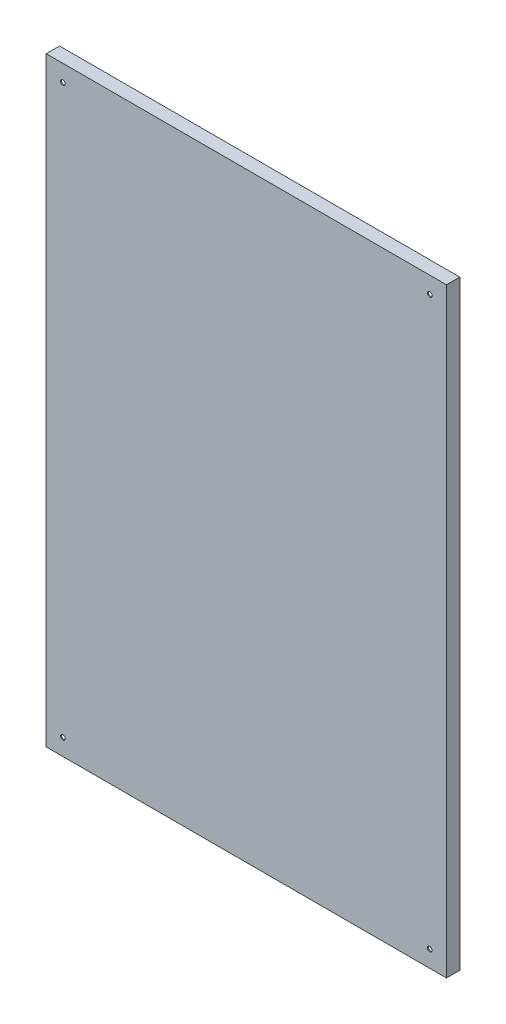
ISO-10303-21;
HEADER;
FILE_DESCRIPTION(('STEP AP214'),'2;1');
FILE_NAME('part.step','',(''),(''),'','','');
FILE_SCHEMA(('AUTOMOTIVE_DESIGN { 1 0 10303 214 1 1 1 1 }'));
ENDSEC;
DATA;
#1=APPLICATION_CONTEXT('core data for automotive mechanical design processes');
#2=APPLICATION_PROTOCOL_DEFINITION('international standard','automotive_design',2000,#1);
#3=PRODUCT_CONTEXT('',#1,'mechanical');
#4=PRODUCT('Part','Part','',(#3));
#5=PRODUCT_RELATED_PRODUCT_CATEGORY('part','',(#4));
#6=PRODUCT_DEFINITION_FORMATION('','',#4);
#7=PRODUCT_DEFINITION_CONTEXT('part definition',#1,'design');
#8=PRODUCT_DEFINITION('design','',#6,#7);
#9=PRODUCT_DEFINITION_SHAPE('','',#8);
#10=(LENGTH_UNIT() NAMED_UNIT(*) SI_UNIT(.MILLI.,.METRE.));
#11=(NAMED_UNIT(*) PLANE_ANGLE_UNIT() SI_UNIT($,.RADIAN.));
#12=(NAMED_UNIT(*) SI_UNIT($,.STERADIAN.) SOLID_ANGLE_UNIT());
#13=UNCERTAINTY_MEASURE_WITH_UNIT(LENGTH_MEASURE(1.E-05),#10,'distance_accuracy_value','');
#14=(GEOMETRIC_REPRESENTATION_CONTEXT(3) GLOBAL_UNCERTAINTY_ASSIGNED_CONTEXT((#13)) GLOBAL_UNIT_ASSIGNED_CONTEXT((#10,
#11,#12)) REPRESENTATION_CONTEXT('',''));
#15=CARTESIAN_POINT('',(0.,0.,0.));
#16=DIRECTION('',(0.,0.,1.));
#17=DIRECTION('',(1.,0.,0.));
#18=AXIS2_PLACEMENT_3D('',#15,#16,#17);
#19=CARTESIAN_POINT('',(-300.,450.,1.5));
#20=DIRECTION('',(1.,0.,0.));
#21=DIRECTION('',(0.,1.,0.));
#22=AXIS2_PLACEMENT_3D('',#19,#20,#21);
#23=PLANE('',#22);
#24=DIRECTION('',(0.,0.,-1.));
#25=VECTOR('',#24,1.);
#26=CARTESIAN_POINT('',(-300.,450.,1.5));
#27=LINE('',#26,#25);
#28=CARTESIAN_POINT('',(-300.,450.,1.5));
#29=VERTEX_POINT('',#28);
#30=CARTESIAN_POINT('',(-300.,450.,-18.5));
#31=VERTEX_POINT('',#30);
#32=EDGE_CURVE('E104',#29,#31,#27,.T.);
#33=ORIENTED_EDGE('',*,*,#32,.T.);
#34=DIRECTION('',(0.,-1.,0.));
#35=VECTOR('',#34,1.);
#36=CARTESIAN_POINT('',(-300.,-450.,-18.5));
#37=LINE('',#36,#35);
#38=CARTESIAN_POINT('',(-300.,-450.,-18.5));
#39=VERTEX_POINT('',#38);
#40=EDGE_CURVE('E107',#31,#39,#37,.T.);
#41=ORIENTED_EDGE('',*,*,#40,.T.);
#42=DIRECTION('',(0.,0.,-1.));
#43=VECTOR('',#42,1.);
#44=CARTESIAN_POINT('',(-300.,-450.,1.5));
#45=LINE('',#44,#43);
#46=CARTESIAN_POINT('',(-300.,-450.,1.5));
#47=VERTEX_POINT('',#46);
#48=EDGE_CURVE('E12',#47,#39,#45,.T.);
#49=ORIENTED_EDGE('',*,*,#48,.F.);
#50=DIRECTION('',(0.,-1.,0.));
#51=VECTOR('',#50,1.);
#52=CARTESIAN_POINT('',(-300.,450.,1.5));
#53=LINE('',#52,#51);
#54=EDGE_CURVE('E108',#29,#47,#53,.T.);
#55=ORIENTED_EDGE('',*,*,#54,.F.);
#56=EDGE_LOOP('',(#33,#41,#49,#55));
#57=FACE_BOUND('',#56,.T.);
#58=ADVANCED_FACE('F37',(#57),#23,.F.);
#59=CARTESIAN_POINT('',(-300.,-450.,1.5));
#60=DIRECTION('',(0.,1.,0.));
#61=DIRECTION('',(-1.,0.,0.));
#62=AXIS2_PLACEMENT_3D('',#59,#60,#61);
#63=PLANE('',#62);
#64=ORIENTED_EDGE('',*,*,#48,.T.);
#65=DIRECTION('',(1.,0.,0.));
#66=VECTOR('',#65,1.);
#67=CARTESIAN_POINT('',(300.,-450.,-18.5));
#68=LINE('',#67,#66);
#69=CARTESIAN_POINT('',(300.,-450.,-18.5));
#70=VERTEX_POINT('',#69);
#71=EDGE_CURVE('E121',#39,#70,#68,.T.);
#72=ORIENTED_EDGE('',*,*,#71,.T.);
#73=DIRECTION('',(0.,0.,-1.));
#74=VECTOR('',#73,1.);
#75=CARTESIAN_POINT('',(300.,-450.,1.5));
#76=LINE('',#75,#74);
#77=CARTESIAN_POINT('',(300.,-450.,1.5));
#78=VERTEX_POINT('',#77);
#79=EDGE_CURVE('E45',#78,#70,#76,.T.);
#80=ORIENTED_EDGE('',*,*,#79,.F.);
#81=DIRECTION('',(1.,0.,0.));
#82=VECTOR('',#81,1.);
#83=CARTESIAN_POINT('',(-300.,-450.,1.5));
#84=LINE('',#83,#82);
#85=EDGE_CURVE('E140',#47,#78,#84,.T.);
#86=ORIENTED_EDGE('',*,*,#85,.F.);
#87=EDGE_LOOP('',(#64,#72,#80,#86));
#88=FACE_BOUND('',#87,.T.);
#89=ADVANCED_FACE('F189',(#88),#63,.F.);
#90=CARTESIAN_POINT('',(300.,450.,1.5));
#91=DIRECTION('',(-1.,0.,0.));
#92=DIRECTION('',(0.,-1.,0.));
#93=AXIS2_PLACEMENT_3D('',#90,#91,#92);
#94=PLANE('',#93);
#95=ORIENTED_EDGE('',*,*,#79,.T.);
#96=DIRECTION('',(0.,1.,0.));
#97=VECTOR('',#96,1.);
#98=CARTESIAN_POINT('',(300.,450.,-18.5));
#99=LINE('',#98,#97);
#100=CARTESIAN_POINT('',(300.,450.,-18.5));
#101=VERTEX_POINT('',#100);
#102=EDGE_CURVE('E125',#70,#101,#99,.T.);
#103=ORIENTED_EDGE('',*,*,#102,.T.);
#104=DIRECTION('',(0.,0.,-1.));
#105=VECTOR('',#104,1.);
#106=CARTESIAN_POINT('',(300.,450.,1.5));
#107=LINE('',#106,#105);
#108=CARTESIAN_POINT('',(300.,450.,1.5));
#109=VERTEX_POINT('',#108);
#110=EDGE_CURVE('E111',#109,#101,#107,.T.);
#111=ORIENTED_EDGE('',*,*,#110,.F.);
#112=DIRECTION('',(0.,1.,0.));
#113=VECTOR('',#112,1.);
#114=CARTESIAN_POINT('',(300.,450.,1.5));
#115=LINE('',#114,#113);
#116=EDGE_CURVE('E142',#78,#109,#115,.T.);
#117=ORIENTED_EDGE('',*,*,#116,.F.);
#118=EDGE_LOOP('',(#95,#103,#111,#117));
#119=FACE_BOUND('',#118,.T.);
#120=ADVANCED_FACE('F202',(#119),#94,.F.);
#121=CARTESIAN_POINT('',(-300.,450.,1.5));
#122=DIRECTION('',(0.,-1.,0.));
#123=DIRECTION('',(1.,0.,0.));
#124=AXIS2_PLACEMENT_3D('',#121,#122,#123);
#125=PLANE('',#124);
#126=ORIENTED_EDGE('',*,*,#110,.T.);
#127=DIRECTION('',(-1.,0.,0.));
#128=VECTOR('',#127,1.);
#129=CARTESIAN_POINT('',(-300.,450.,-18.5));
#130=LINE('',#129,#128);
#131=EDGE_CURVE('E118',#101,#31,#130,.T.);
#132=ORIENTED_EDGE('',*,*,#131,.T.);
#133=ORIENTED_EDGE('',*,*,#32,.F.);
#134=DIRECTION('',(-1.,0.,0.));
#135=VECTOR('',#134,1.);
#136=CARTESIAN_POINT('',(-300.,450.,1.5));
#137=LINE('',#136,#135);
#138=EDGE_CURVE('E61',#109,#29,#137,.T.);
#139=ORIENTED_EDGE('',*,*,#138,.F.);
#140=EDGE_LOOP('',(#126,#132,#133,#139));
#141=FACE_BOUND('',#140,.T.);
#142=ADVANCED_FACE('F123',(#141),#125,.F.);
#143=CARTESIAN_POINT('',(0.,0.,1.5));
#144=DIRECTION('',(0.,0.,1.));
#145=DIRECTION('',(1.,0.,0.));
#146=AXIS2_PLACEMENT_3D('',#143,#144,#145);
#147=PLANE('',#146);
#148=CARTESIAN_POINT('',(275.,-425.,1.5));
#149=DIRECTION('',(0.,0.,1.));
#150=DIRECTION('',(1.,0.,0.));
#151=AXIS2_PLACEMENT_3D('',#148,#149,#150);
#152=CIRCLE('',#151,3.50000000000002);
#153=CARTESIAN_POINT('',(278.5,-425.,1.5));
#154=VERTEX_POINT('',#153);
#155=EDGE_CURVE('E166',#154,#154,#152,.T.);
#156=ORIENTED_EDGE('',*,*,#155,.F.);
#157=EDGE_LOOP('',(#156));
#158=FACE_BOUND('',#157,.T.);
#159=CARTESIAN_POINT('',(-275.,-425.,1.5));
#160=DIRECTION('',(0.,0.,1.));
#161=DIRECTION('',(1.,0.,0.));
#162=AXIS2_PLACEMENT_3D('',#159,#160,#161);
#163=CIRCLE('',#162,3.50000000000002);
#164=CARTESIAN_POINT('',(-271.5,-425.,1.5));
#165=VERTEX_POINT('',#164);
#166=EDGE_CURVE('E156',#165,#165,#163,.T.);
#167=ORIENTED_EDGE('',*,*,#166,.F.);
#168=EDGE_LOOP('',(#167));
#169=FACE_BOUND('',#168,.T.);
#170=CARTESIAN_POINT('',(275.,425.,1.5));
#171=DIRECTION('',(0.,0.,1.));
#172=DIRECTION('',(1.,0.,0.));
#173=AXIS2_PLACEMENT_3D('',#170,#171,#172);
#174=CIRCLE('',#173,3.50000000000002);
#175=CARTESIAN_POINT('',(278.5,425.,1.5));
#176=VERTEX_POINT('',#175);
#177=EDGE_CURVE('E153',#176,#176,#174,.T.);
#178=ORIENTED_EDGE('',*,*,#177,.F.);
#179=EDGE_LOOP('',(#178));
#180=FACE_BOUND('',#179,.T.);
#181=CARTESIAN_POINT('',(-275.,425.,1.5));
#182=DIRECTION('',(0.,0.,1.));
#183=DIRECTION('',(1.,0.,0.));
#184=AXIS2_PLACEMENT_3D('',#181,#182,#183);
#185=CIRCLE('',#184,3.50000000000002);
#186=CARTESIAN_POINT('',(-271.5,425.,1.5));
#187=VERTEX_POINT('',#186);
#188=EDGE_CURVE('E150',#187,#187,#185,.T.);
#189=ORIENTED_EDGE('',*,*,#188,.F.);
#190=EDGE_LOOP('',(#189));
#191=FACE_BOUND('',#190,.T.);
#192=ORIENTED_EDGE('',*,*,#54,.T.);
#193=ORIENTED_EDGE('',*,*,#85,.T.);
#194=ORIENTED_EDGE('',*,*,#116,.T.);
#195=ORIENTED_EDGE('',*,*,#138,.T.);
#196=EDGE_LOOP('',(#192,#193,#194,#195));
#197=FACE_BOUND('',#196,.T.);
#198=ADVANCED_FACE('F191',(#158,#169,#180,#191,#197),#147,.T.);
#199=CARTESIAN_POINT('',(298.5,-448.5,-1120.1653826392));
#200=DIRECTION('',(0.,1.,0.));
#201=DIRECTION('',(-1.,0.,0.));
#202=AXIS2_PLACEMENT_3D('',#199,#200,#201);
#203=PLANE('',#202);
#204=DIRECTION('',(1.,0.,0.));
#205=VECTOR('',#204,1.);
#206=CARTESIAN_POINT('',(298.5,-448.5,-18.5));
#207=LINE('',#206,#205);
#208=CARTESIAN_POINT('',(-298.5,-448.5,-18.5));
#209=VERTEX_POINT('',#208);
#210=CARTESIAN_POINT('',(298.5,-448.5,-18.5));
#211=VERTEX_POINT('',#210);
#212=EDGE_CURVE('E131',#209,#211,#207,.T.);
#213=ORIENTED_EDGE('',*,*,#212,.F.);
#214=DIRECTION('',(0.,0.,1.));
#215=VECTOR('',#214,1.);
#216=CARTESIAN_POINT('',(-298.5,-448.5,-1120.1653826392));
#217=LINE('',#216,#215);
#218=CARTESIAN_POINT('',(-298.5,-448.5,0.));
#219=VERTEX_POINT('',#218);
#220=EDGE_CURVE('E127',#209,#219,#217,.T.);
#221=ORIENTED_EDGE('',*,*,#220,.T.);
#222=DIRECTION('',(-1.,0.,0.));
#223=VECTOR('',#222,1.);
#224=CARTESIAN_POINT('',(298.5,-448.5,0.));
#225=LINE('',#224,#223);
#226=CARTESIAN_POINT('',(298.5,-448.5,0.));
#227=VERTEX_POINT('',#226);
#228=EDGE_CURVE('E53',#227,#219,#225,.T.);
#229=ORIENTED_EDGE('',*,*,#228,.F.);
#230=DIRECTION('',(0.,0.,1.));
#231=VECTOR('',#230,1.);
#232=CARTESIAN_POINT('',(298.5,-448.5,-1120.1653826392));
#233=LINE('',#232,#231);
#234=EDGE_CURVE('E134',#211,#227,#233,.T.);
#235=ORIENTED_EDGE('',*,*,#234,.F.);
#236=EDGE_LOOP('',(#213,#221,#229,#235));
#237=FACE_BOUND('',#236,.T.);
#238=ADVANCED_FACE('F193',(#237),#203,.T.);
#239=CARTESIAN_POINT('',(-298.5,-448.5,-1120.1653826392));
#240=DIRECTION('',(1.,0.,0.));
#241=DIRECTION('',(0.,0.,-1.));
#242=AXIS2_PLACEMENT_3D('',#239,#240,#241);
#243=PLANE('',#242);
#244=DIRECTION('',(0.,-1.,0.));
#245=VECTOR('',#244,1.);
#246=CARTESIAN_POINT('',(-298.5,-448.5,-18.5));
#247=LINE('',#246,#245);
#248=CARTESIAN_POINT('',(-298.5,448.5,-18.5));
#249=VERTEX_POINT('',#248);
#250=EDGE_CURVE('E135',#249,#209,#247,.T.);
#251=ORIENTED_EDGE('',*,*,#250,.F.);
#252=DIRECTION('',(0.,0.,1.));
#253=VECTOR('',#252,1.);
#254=CARTESIAN_POINT('',(-298.5,448.5,-1120.1653826392));
#255=LINE('',#254,#253);
#256=CARTESIAN_POINT('',(-298.5,448.5,0.));
#257=VERTEX_POINT('',#256);
#258=EDGE_CURVE('E183',#249,#257,#255,.T.);
#259=ORIENTED_EDGE('',*,*,#258,.T.);
#260=DIRECTION('',(0.,1.,0.));
#261=VECTOR('',#260,1.);
#262=CARTESIAN_POINT('',(-298.5,-448.5,0.));
#263=LINE('',#262,#261);
#264=EDGE_CURVE('E177',#219,#257,#263,.T.);
#265=ORIENTED_EDGE('',*,*,#264,.F.);
#266=ORIENTED_EDGE('',*,*,#220,.F.);
#267=EDGE_LOOP('',(#251,#259,#265,#266));
#268=FACE_BOUND('',#267,.T.);
#269=ADVANCED_FACE('F200',(#268),#243,.T.);
#270=CARTESIAN_POINT('',(-298.5,448.5,-1120.1653826392));
#271=DIRECTION('',(0.,-1.,0.));
#272=DIRECTION('',(1.,0.,0.));
#273=AXIS2_PLACEMENT_3D('',#270,#271,#272);
#274=PLANE('',#273);
#275=DIRECTION('',(-1.,0.,0.));
#276=VECTOR('',#275,1.);
#277=CARTESIAN_POINT('',(-298.5,448.5,-18.5));
#278=LINE('',#277,#276);
#279=CARTESIAN_POINT('',(298.5,448.5,-18.5));
#280=VERTEX_POINT('',#279);
#281=EDGE_CURVE('E137',#280,#249,#278,.T.);
#282=ORIENTED_EDGE('',*,*,#281,.F.);
#283=DIRECTION('',(0.,0.,1.));
#284=VECTOR('',#283,1.);
#285=CARTESIAN_POINT('',(298.5,448.5,-1120.1653826392));
#286=LINE('',#285,#284);
#287=CARTESIAN_POINT('',(298.5,448.5,0.));
#288=VERTEX_POINT('',#287);
#289=EDGE_CURVE('E185',#280,#288,#286,.T.);
#290=ORIENTED_EDGE('',*,*,#289,.T.);
#291=DIRECTION('',(1.,0.,0.));
#292=VECTOR('',#291,1.);
#293=CARTESIAN_POINT('',(-298.5,448.5,0.));
#294=LINE('',#293,#292);
#295=EDGE_CURVE('E174',#257,#288,#294,.T.);
#296=ORIENTED_EDGE('',*,*,#295,.F.);
#297=ORIENTED_EDGE('',*,*,#258,.F.);
#298=EDGE_LOOP('',(#282,#290,#296,#297));
#299=FACE_BOUND('',#298,.T.);
#300=ADVANCED_FACE('F249',(#299),#274,.T.);
#301=CARTESIAN_POINT('',(298.5,448.5,-1120.1653826392));
#302=DIRECTION('',(-1.,0.,0.));
#303=DIRECTION('',(0.,-1.,0.));
#304=AXIS2_PLACEMENT_3D('',#301,#302,#303);
#305=PLANE('',#304);
#306=DIRECTION('',(0.,1.,0.));
#307=VECTOR('',#306,1.);
#308=CARTESIAN_POINT('',(298.5,448.5,-18.5));
#309=LINE('',#308,#307);
#310=EDGE_CURVE('E133',#211,#280,#309,.T.);
#311=ORIENTED_EDGE('',*,*,#310,.F.);
#312=ORIENTED_EDGE('',*,*,#234,.T.);
#313=DIRECTION('',(0.,-1.,0.));
#314=VECTOR('',#313,1.);
#315=CARTESIAN_POINT('',(298.5,448.5,0.));
#316=LINE('',#315,#314);
#317=EDGE_CURVE('E171',#288,#227,#316,.T.);
#318=ORIENTED_EDGE('',*,*,#317,.F.);
#319=ORIENTED_EDGE('',*,*,#289,.F.);
#320=EDGE_LOOP('',(#311,#312,#318,#319));
#321=FACE_BOUND('',#320,.T.);
#322=ADVANCED_FACE('F228',(#321),#305,.T.);
#323=CARTESIAN_POINT('',(0.,0.,-18.5));
#324=DIRECTION('',(0.,0.,1.));
#325=DIRECTION('',(1.,0.,0.));
#326=AXIS2_PLACEMENT_3D('',#323,#324,#325);
#327=PLANE('',#326);
#328=ORIENTED_EDGE('',*,*,#212,.T.);
#329=ORIENTED_EDGE('',*,*,#310,.T.);
#330=ORIENTED_EDGE('',*,*,#281,.T.);
#331=ORIENTED_EDGE('',*,*,#250,.T.);
#332=EDGE_LOOP('',(#328,#329,#330,#331));
#333=FACE_BOUND('',#332,.T.);
#334=ORIENTED_EDGE('',*,*,#40,.F.);
#335=ORIENTED_EDGE('',*,*,#131,.F.);
#336=ORIENTED_EDGE('',*,*,#102,.F.);
#337=ORIENTED_EDGE('',*,*,#71,.F.);
#338=EDGE_LOOP('',(#334,#335,#336,#337));
#339=FACE_BOUND('',#338,.T.);
#340=ADVANCED_FACE('F116',(#333,#339),#327,.F.);
#341=CARTESIAN_POINT('',(0.,0.,0.));
#342=DIRECTION('',(0.,0.,1.));
#343=DIRECTION('',(1.,0.,0.));
#344=AXIS2_PLACEMENT_3D('',#341,#342,#343);
#345=PLANE('',#344);
#346=CARTESIAN_POINT('',(275.,-425.,0.));
#347=DIRECTION('',(0.,0.,1.));
#348=DIRECTION('',(1.,0.,0.));
#349=AXIS2_PLACEMENT_3D('',#346,#347,#348);
#350=CIRCLE('',#349,3.50000000000002);
#351=CARTESIAN_POINT('',(278.5,-425.,0.));
#352=VERTEX_POINT('',#351);
#353=EDGE_CURVE('E40',#352,#352,#350,.T.);
#354=ORIENTED_EDGE('',*,*,#353,.T.);
#355=EDGE_LOOP('',(#354));
#356=FACE_BOUND('',#355,.T.);
#357=CARTESIAN_POINT('',(-275.,-425.,0.));
#358=DIRECTION('',(0.,0.,1.));
#359=DIRECTION('',(1.,0.,0.));
#360=AXIS2_PLACEMENT_3D('',#357,#358,#359);
#361=CIRCLE('',#360,3.50000000000002);
#362=CARTESIAN_POINT('',(-271.5,-425.,0.));
#363=VERTEX_POINT('',#362);
#364=EDGE_CURVE('E154',#363,#363,#361,.T.);
#365=ORIENTED_EDGE('',*,*,#364,.T.);
#366=EDGE_LOOP('',(#365));
#367=FACE_BOUND('',#366,.T.);
#368=CARTESIAN_POINT('',(275.,425.,0.));
#369=DIRECTION('',(0.,0.,1.));
#370=DIRECTION('',(1.,0.,0.));
#371=AXIS2_PLACEMENT_3D('',#368,#369,#370);
#372=CIRCLE('',#371,3.50000000000002);
#373=CARTESIAN_POINT('',(278.5,425.,0.));
#374=VERTEX_POINT('',#373);
#375=EDGE_CURVE('E151',#374,#374,#372,.T.);
#376=ORIENTED_EDGE('',*,*,#375,.T.);
#377=EDGE_LOOP('',(#376));
#378=FACE_BOUND('',#377,.T.);
#379=CARTESIAN_POINT('',(-275.,425.,0.));
#380=DIRECTION('',(0.,0.,1.));
#381=DIRECTION('',(1.,0.,0.));
#382=AXIS2_PLACEMENT_3D('',#379,#380,#381);
#383=CIRCLE('',#382,3.50000000000002);
#384=CARTESIAN_POINT('',(-271.5,425.,0.));
#385=VERTEX_POINT('',#384);
#386=EDGE_CURVE('E147',#385,#385,#383,.T.);
#387=ORIENTED_EDGE('',*,*,#386,.T.);
#388=EDGE_LOOP('',(#387));
#389=FACE_BOUND('',#388,.T.);
#390=ORIENTED_EDGE('',*,*,#317,.T.);
#391=ORIENTED_EDGE('',*,*,#228,.T.);
#392=ORIENTED_EDGE('',*,*,#264,.T.);
#393=ORIENTED_EDGE('',*,*,#295,.T.);
#394=EDGE_LOOP('',(#390,#391,#392,#393));
#395=FACE_BOUND('',#394,.T.);
#396=ADVANCED_FACE('F217',(#356,#367,#378,#389,#395),#345,.F.);
#397=CARTESIAN_POINT('',(-275.,425.,-8.5));
#398=DIRECTION('',(0.,0.,1.));
#399=DIRECTION('',(1.,0.,0.));
#400=AXIS2_PLACEMENT_3D('',#397,#398,#399);
#401=CYLINDRICAL_SURFACE('',#400,3.50000000000002);
#402=ORIENTED_EDGE('',*,*,#188,.T.);
#403=EDGE_LOOP('',(#402));
#404=FACE_BOUND('',#403,.T.);
#405=ORIENTED_EDGE('',*,*,#386,.F.);
#406=EDGE_LOOP('',(#405));
#407=FACE_BOUND('',#406,.T.);
#408=ADVANCED_FACE('F219',(#404,#407),#401,.F.);
#409=CARTESIAN_POINT('',(275.,425.,-8.5));
#410=DIRECTION('',(0.,0.,1.));
#411=DIRECTION('',(1.,0.,0.));
#412=AXIS2_PLACEMENT_3D('',#409,#410,#411);
#413=CYLINDRICAL_SURFACE('',#412,3.50000000000002);
#414=ORIENTED_EDGE('',*,*,#177,.T.);
#415=EDGE_LOOP('',(#414));
#416=FACE_BOUND('',#415,.T.);
#417=ORIENTED_EDGE('',*,*,#375,.F.);
#418=EDGE_LOOP('',(#417));
#419=FACE_BOUND('',#418,.T.);
#420=ADVANCED_FACE('F225',(#416,#419),#413,.F.);
#421=CARTESIAN_POINT('',(-275.,-425.,-8.5));
#422=DIRECTION('',(0.,0.,1.));
#423=DIRECTION('',(1.,0.,0.));
#424=AXIS2_PLACEMENT_3D('',#421,#422,#423);
#425=CYLINDRICAL_SURFACE('',#424,3.50000000000002);
#426=ORIENTED_EDGE('',*,*,#166,.T.);
#427=EDGE_LOOP('',(#426));
#428=FACE_BOUND('',#427,.T.);
#429=ORIENTED_EDGE('',*,*,#364,.F.);
#430=EDGE_LOOP('',(#429));
#431=FACE_BOUND('',#430,.T.);
#432=ADVANCED_FACE('F261',(#428,#431),#425,.F.);
#433=CARTESIAN_POINT('',(275.,-425.,-8.5));
#434=DIRECTION('',(0.,0.,1.));
#435=DIRECTION('',(1.,0.,0.));
#436=AXIS2_PLACEMENT_3D('',#433,#434,#435);
#437=CYLINDRICAL_SURFACE('',#436,3.50000000000002);
#438=ORIENTED_EDGE('',*,*,#155,.T.);
#439=EDGE_LOOP('',(#438));
#440=FACE_BOUND('',#439,.T.);
#441=ORIENTED_EDGE('',*,*,#353,.F.);
#442=EDGE_LOOP('',(#441));
#443=FACE_BOUND('',#442,.T.);
#444=ADVANCED_FACE('F265',(#440,#443),#437,.F.);
#445=CLOSED_SHELL('',(#58,#89,#120,#142,#198,#238,#269,#300,#322,#340,#396,#408,#420,#432,#444));
#446=MANIFOLD_SOLID_BREP('B2',#445);
#447=ADVANCED_BREP_SHAPE_REPRESENTATION('',(#18,#446),#14);
#448=SHAPE_DEFINITION_REPRESENTATION(#9,#447);
ENDSEC;
END-ISO-10303-21;
